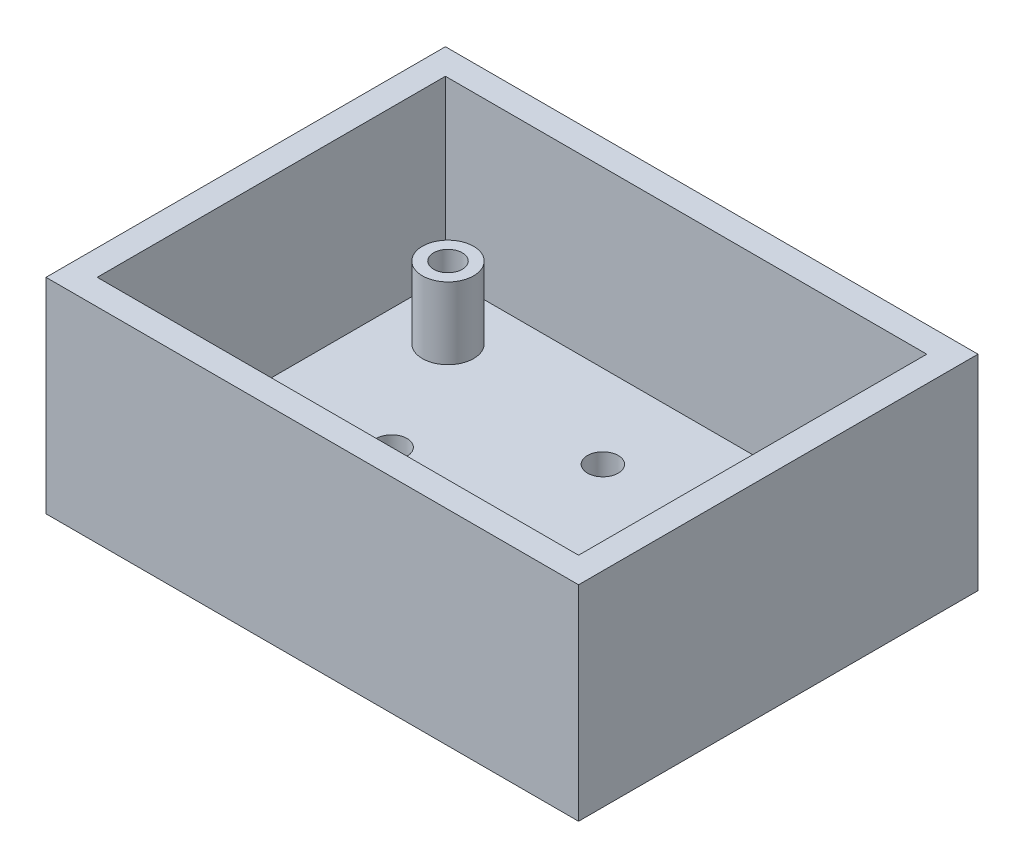
ISO-10303-21;
HEADER;
FILE_DESCRIPTION(('STEP AP214'),'2;1');
FILE_NAME('part.step','',(''),(''),'','','');
FILE_SCHEMA(('AUTOMOTIVE_DESIGN { 1 0 10303 214 1 1 1 1 }'));
ENDSEC;
DATA;
#1=APPLICATION_CONTEXT('core data for automotive mechanical design processes');
#2=APPLICATION_PROTOCOL_DEFINITION('international standard','automotive_design',2000,#1);
#3=PRODUCT_CONTEXT('',#1,'mechanical');
#4=PRODUCT('Part','Part','',(#3));
#5=PRODUCT_RELATED_PRODUCT_CATEGORY('part','',(#4));
#6=PRODUCT_DEFINITION_FORMATION('','',#4);
#7=PRODUCT_DEFINITION_CONTEXT('part definition',#1,'design');
#8=PRODUCT_DEFINITION('design','',#6,#7);
#9=PRODUCT_DEFINITION_SHAPE('','',#8);
#10=(LENGTH_UNIT() NAMED_UNIT(*) SI_UNIT(.MILLI.,.METRE.));
#11=(NAMED_UNIT(*) PLANE_ANGLE_UNIT() SI_UNIT($,.RADIAN.));
#12=(NAMED_UNIT(*) SI_UNIT($,.STERADIAN.) SOLID_ANGLE_UNIT());
#13=UNCERTAINTY_MEASURE_WITH_UNIT(LENGTH_MEASURE(1.E-05),#10,'distance_accuracy_value','');
#14=(GEOMETRIC_REPRESENTATION_CONTEXT(3) GLOBAL_UNCERTAINTY_ASSIGNED_CONTEXT((#13)) GLOBAL_UNIT_ASSIGNED_CONTEXT((#10,
#11,#12)) REPRESENTATION_CONTEXT('',''));
#15=CARTESIAN_POINT('',(0.,0.,0.));
#16=DIRECTION('',(0.,0.,1.));
#17=DIRECTION('',(1.,0.,0.));
#18=AXIS2_PLACEMENT_3D('',#15,#16,#17);
#19=CARTESIAN_POINT('',(23.5,20.,-17.));
#20=DIRECTION('',(-1.,0.,0.));
#21=DIRECTION('',(0.,0.,1.));
#22=AXIS2_PLACEMENT_3D('',#19,#20,#21);
#23=PLANE('',#22);
#24=DIRECTION('',(0.,-1.,0.));
#25=VECTOR('',#24,1.);
#26=CARTESIAN_POINT('',(23.5,20.,-17.));
#27=LINE('',#26,#25);
#28=CARTESIAN_POINT('',(23.5,20.,-17.));
#29=VERTEX_POINT('',#28);
#30=CARTESIAN_POINT('',(23.5,3.,-17.));
#31=VERTEX_POINT('',#30);
#32=EDGE_CURVE('E113',#29,#31,#27,.T.);
#33=ORIENTED_EDGE('',*,*,#32,.T.);
#34=DIRECTION('',(0.,0.,1.));
#35=VECTOR('',#34,1.);
#36=CARTESIAN_POINT('',(23.5,3.,-17.));
#37=LINE('',#36,#35);
#38=CARTESIAN_POINT('',(23.5,3.,17.));
#39=VERTEX_POINT('',#38);
#40=EDGE_CURVE('E101',#31,#39,#37,.T.);
#41=ORIENTED_EDGE('',*,*,#40,.T.);
#42=DIRECTION('',(0.,-1.,0.));
#43=VECTOR('',#42,1.);
#44=CARTESIAN_POINT('',(23.5,20.,17.));
#45=LINE('',#44,#43);
#46=CARTESIAN_POINT('',(23.5,20.,17.));
#47=VERTEX_POINT('',#46);
#48=EDGE_CURVE('E110',#47,#39,#45,.T.);
#49=ORIENTED_EDGE('',*,*,#48,.F.);
#50=DIRECTION('',(0.,0.,-1.));
#51=VECTOR('',#50,1.);
#52=CARTESIAN_POINT('',(23.5,20.,-17.));
#53=LINE('',#52,#51);
#54=EDGE_CURVE('E114',#47,#29,#53,.T.);
#55=ORIENTED_EDGE('',*,*,#54,.T.);
#56=EDGE_LOOP('',(#33,#41,#49,#55));
#57=FACE_BOUND('',#56,.T.);
#58=ADVANCED_FACE('F35',(#57),#23,.T.);
#59=CARTESIAN_POINT('',(-23.5,20.,-17.));
#60=DIRECTION('',(0.,0.,1.));
#61=DIRECTION('',(1.,0.,0.));
#62=AXIS2_PLACEMENT_3D('',#59,#60,#61);
#63=PLANE('',#62);
#64=DIRECTION('',(0.,-1.,0.));
#65=VECTOR('',#64,1.);
#66=CARTESIAN_POINT('',(-23.5,20.,-17.));
#67=LINE('',#66,#65);
#68=CARTESIAN_POINT('',(-23.5,20.,-17.));
#69=VERTEX_POINT('',#68);
#70=CARTESIAN_POINT('',(-23.5,3.,-17.));
#71=VERTEX_POINT('',#70);
#72=EDGE_CURVE('E121',#69,#71,#67,.T.);
#73=ORIENTED_EDGE('',*,*,#72,.T.);
#74=DIRECTION('',(1.,0.,0.));
#75=VECTOR('',#74,1.);
#76=CARTESIAN_POINT('',(-23.5,3.,-17.));
#77=LINE('',#76,#75);
#78=EDGE_CURVE('E115',#71,#31,#77,.T.);
#79=ORIENTED_EDGE('',*,*,#78,.T.);
#80=ORIENTED_EDGE('',*,*,#32,.F.);
#81=DIRECTION('',(-1.,0.,0.));
#82=VECTOR('',#81,1.);
#83=CARTESIAN_POINT('',(-23.5,20.,-17.));
#84=LINE('',#83,#82);
#85=EDGE_CURVE('E200',#29,#69,#84,.T.);
#86=ORIENTED_EDGE('',*,*,#85,.T.);
#87=EDGE_LOOP('',(#73,#79,#80,#86));
#88=FACE_BOUND('',#87,.T.);
#89=ADVANCED_FACE('F209',(#88),#63,.T.);
#90=CARTESIAN_POINT('',(-23.5,20.,-17.));
#91=DIRECTION('',(1.,0.,0.));
#92=DIRECTION('',(0.,0.,-1.));
#93=AXIS2_PLACEMENT_3D('',#90,#91,#92);
#94=PLANE('',#93);
#95=DIRECTION('',(0.,-1.,0.));
#96=VECTOR('',#95,1.);
#97=CARTESIAN_POINT('',(-23.5,20.,17.));
#98=LINE('',#97,#96);
#99=CARTESIAN_POINT('',(-23.5,20.,17.));
#100=VERTEX_POINT('',#99);
#101=CARTESIAN_POINT('',(-23.5,3.,17.));
#102=VERTEX_POINT('',#101);
#103=EDGE_CURVE('E58',#100,#102,#98,.T.);
#104=ORIENTED_EDGE('',*,*,#103,.T.);
#105=DIRECTION('',(0.,0.,-1.));
#106=VECTOR('',#105,1.);
#107=CARTESIAN_POINT('',(-23.5,3.,-17.));
#108=LINE('',#107,#106);
#109=EDGE_CURVE('E51',#102,#71,#108,.T.);
#110=ORIENTED_EDGE('',*,*,#109,.T.);
#111=ORIENTED_EDGE('',*,*,#72,.F.);
#112=DIRECTION('',(0.,0.,1.));
#113=VECTOR('',#112,1.);
#114=CARTESIAN_POINT('',(-23.5,20.,-17.));
#115=LINE('',#114,#113);
#116=EDGE_CURVE('E123',#69,#100,#115,.T.);
#117=ORIENTED_EDGE('',*,*,#116,.T.);
#118=EDGE_LOOP('',(#104,#110,#111,#117));
#119=FACE_BOUND('',#118,.T.);
#120=ADVANCED_FACE('F204',(#119),#94,.T.);
#121=CARTESIAN_POINT('',(-23.5,20.,17.));
#122=DIRECTION('',(0.,0.,-1.));
#123=DIRECTION('',(-1.,0.,0.));
#124=AXIS2_PLACEMENT_3D('',#121,#122,#123);
#125=PLANE('',#124);
#126=ORIENTED_EDGE('',*,*,#48,.T.);
#127=DIRECTION('',(-1.,0.,0.));
#128=VECTOR('',#127,1.);
#129=CARTESIAN_POINT('',(-23.5,3.,17.));
#130=LINE('',#129,#128);
#131=EDGE_CURVE('E98',#39,#102,#130,.T.);
#132=ORIENTED_EDGE('',*,*,#131,.T.);
#133=ORIENTED_EDGE('',*,*,#103,.F.);
#134=DIRECTION('',(1.,0.,0.));
#135=VECTOR('',#134,1.);
#136=CARTESIAN_POINT('',(-23.5,20.,17.));
#137=LINE('',#136,#135);
#138=EDGE_CURVE('E119',#100,#47,#137,.T.);
#139=ORIENTED_EDGE('',*,*,#138,.T.);
#140=EDGE_LOOP('',(#126,#132,#133,#139));
#141=FACE_BOUND('',#140,.T.);
#142=ADVANCED_FACE('F117',(#141),#125,.T.);
#143=CARTESIAN_POINT('',(0.,20.,0.));
#144=DIRECTION('',(0.,1.,0.));
#145=DIRECTION('',(0.,0.,1.));
#146=AXIS2_PLACEMENT_3D('',#143,#144,#145);
#147=PLANE('',#146);
#148=DIRECTION('',(0.,0.,-1.));
#149=VECTOR('',#148,1.);
#150=CARTESIAN_POINT('',(26.,20.,-19.5));
#151=LINE('',#150,#149);
#152=CARTESIAN_POINT('',(26.,20.,19.5));
#153=VERTEX_POINT('',#152);
#154=CARTESIAN_POINT('',(26.,20.,-19.5));
#155=VERTEX_POINT('',#154);
#156=EDGE_CURVE('E131',#153,#155,#151,.T.);
#157=ORIENTED_EDGE('',*,*,#156,.T.);
#158=DIRECTION('',(-1.,0.,0.));
#159=VECTOR('',#158,1.);
#160=CARTESIAN_POINT('',(-26.,20.,-19.5));
#161=LINE('',#160,#159);
#162=CARTESIAN_POINT('',(-26.,20.,-19.5));
#163=VERTEX_POINT('',#162);
#164=EDGE_CURVE('E134',#155,#163,#161,.T.);
#165=ORIENTED_EDGE('',*,*,#164,.T.);
#166=DIRECTION('',(0.,0.,1.));
#167=VECTOR('',#166,1.);
#168=CARTESIAN_POINT('',(-26.,20.,-19.5));
#169=LINE('',#168,#167);
#170=CARTESIAN_POINT('',(-26.,20.,19.5));
#171=VERTEX_POINT('',#170);
#172=EDGE_CURVE('E137',#163,#171,#169,.T.);
#173=ORIENTED_EDGE('',*,*,#172,.T.);
#174=DIRECTION('',(1.,0.,0.));
#175=VECTOR('',#174,1.);
#176=CARTESIAN_POINT('',(-26.,20.,19.5));
#177=LINE('',#176,#175);
#178=EDGE_CURVE('E139',#171,#153,#177,.T.);
#179=ORIENTED_EDGE('',*,*,#178,.T.);
#180=EDGE_LOOP('',(#157,#165,#173,#179));
#181=FACE_BOUND('',#180,.T.);
#182=ORIENTED_EDGE('',*,*,#85,.F.);
#183=ORIENTED_EDGE('',*,*,#54,.F.);
#184=ORIENTED_EDGE('',*,*,#138,.F.);
#185=ORIENTED_EDGE('',*,*,#116,.F.);
#186=EDGE_LOOP('',(#182,#183,#184,#185));
#187=FACE_BOUND('',#186,.T.);
#188=ADVANCED_FACE('F207',(#181,#187),#147,.T.);
#189=CARTESIAN_POINT('',(0.,0.,0.));
#190=DIRECTION('',(0.,1.,0.));
#191=DIRECTION('',(0.,0.,1.));
#192=AXIS2_PLACEMENT_3D('',#189,#190,#191);
#193=PLANE('',#192);
#194=CARTESIAN_POINT('',(11.75,0.,0.));
#195=DIRECTION('',(0.,1.,0.));
#196=DIRECTION('',(0.,0.,1.));
#197=AXIS2_PLACEMENT_3D('',#194,#195,#196);
#198=CIRCLE('',#197,1.5);
#199=CARTESIAN_POINT('',(11.75,0.,1.5));
#200=VERTEX_POINT('',#199);
#201=EDGE_CURVE('E518',#200,#200,#198,.T.);
#202=ORIENTED_EDGE('',*,*,#201,.T.);
#203=EDGE_LOOP('',(#202));
#204=FACE_BOUND('',#203,.T.);
#205=CARTESIAN_POINT('',(0.,0.,8.87235349110716));
#206=DIRECTION('',(0.,1.,0.));
#207=DIRECTION('',(0.,0.,-1.));
#208=AXIS2_PLACEMENT_3D('',#205,#206,#207);
#209=CIRCLE('',#208,1.5);
#210=CARTESIAN_POINT('',(0.,0.,7.37235349110716));
#211=VERTEX_POINT('',#210);
#212=EDGE_CURVE('E522',#211,#211,#209,.T.);
#213=ORIENTED_EDGE('',*,*,#212,.T.);
#214=EDGE_LOOP('',(#213));
#215=FACE_BOUND('',#214,.T.);
#216=CARTESIAN_POINT('',(-11.75,0.,0.));
#217=DIRECTION('',(0.,1.,0.));
#218=DIRECTION('',(0.,0.,-1.));
#219=AXIS2_PLACEMENT_3D('',#216,#217,#218);
#220=CIRCLE('',#219,1.5);
#221=CARTESIAN_POINT('',(-11.75,0.,-1.5));
#222=VERTEX_POINT('',#221);
#223=EDGE_CURVE('E532',#222,#222,#220,.T.);
#224=ORIENTED_EDGE('',*,*,#223,.T.);
#225=EDGE_LOOP('',(#224));
#226=FACE_BOUND('',#225,.T.);
#227=CARTESIAN_POINT('',(0.,0.,-8.87235349110716));
#228=DIRECTION('',(0.,1.,0.));
#229=DIRECTION('',(0.,0.,1.));
#230=AXIS2_PLACEMENT_3D('',#227,#228,#229);
#231=CIRCLE('',#230,1.5);
#232=CARTESIAN_POINT('',(0.,0.,-7.37235349110716));
#233=VERTEX_POINT('',#232);
#234=EDGE_CURVE('E538',#233,#233,#231,.T.);
#235=ORIENTED_EDGE('',*,*,#234,.T.);
#236=EDGE_LOOP('',(#235));
#237=FACE_BOUND('',#236,.T.);
#238=DIRECTION('',(0.,0.,-1.));
#239=VECTOR('',#238,1.);
#240=CARTESIAN_POINT('',(26.,0.,-19.5));
#241=LINE('',#240,#239);
#242=CARTESIAN_POINT('',(26.,0.,19.5));
#243=VERTEX_POINT('',#242);
#244=CARTESIAN_POINT('',(26.,0.,-19.5));
#245=VERTEX_POINT('',#244);
#246=EDGE_CURVE('E130',#243,#245,#241,.T.);
#247=ORIENTED_EDGE('',*,*,#246,.F.);
#248=DIRECTION('',(1.,0.,0.));
#249=VECTOR('',#248,1.);
#250=CARTESIAN_POINT('',(-26.,0.,19.5));
#251=LINE('',#250,#249);
#252=CARTESIAN_POINT('',(-26.,0.,19.5));
#253=VERTEX_POINT('',#252);
#254=EDGE_CURVE('E135',#253,#243,#251,.T.);
#255=ORIENTED_EDGE('',*,*,#254,.F.);
#256=DIRECTION('',(0.,0.,1.));
#257=VECTOR('',#256,1.);
#258=CARTESIAN_POINT('',(-26.,0.,-19.5));
#259=LINE('',#258,#257);
#260=CARTESIAN_POINT('',(-26.,0.,-19.5));
#261=VERTEX_POINT('',#260);
#262=EDGE_CURVE('E147',#261,#253,#259,.T.);
#263=ORIENTED_EDGE('',*,*,#262,.F.);
#264=DIRECTION('',(-1.,0.,0.));
#265=VECTOR('',#264,1.);
#266=CARTESIAN_POINT('',(-26.,0.,-19.5));
#267=LINE('',#266,#265);
#268=EDGE_CURVE('E144',#245,#261,#267,.T.);
#269=ORIENTED_EDGE('',*,*,#268,.F.);
#270=EDGE_LOOP('',(#247,#255,#263,#269));
#271=FACE_BOUND('',#270,.T.);
#272=ADVANCED_FACE('F222',(#204,#215,#226,#237,#271),#193,.F.);
#273=CARTESIAN_POINT('',(26.,20.,-19.5));
#274=DIRECTION('',(-1.,0.,0.));
#275=DIRECTION('',(0.,0.,1.));
#276=AXIS2_PLACEMENT_3D('',#273,#274,#275);
#277=PLANE('',#276);
#278=ORIENTED_EDGE('',*,*,#246,.T.);
#279=DIRECTION('',(0.,-1.,0.));
#280=VECTOR('',#279,1.);
#281=CARTESIAN_POINT('',(26.,20.,-19.5));
#282=LINE('',#281,#280);
#283=EDGE_CURVE('E105',#155,#245,#282,.T.);
#284=ORIENTED_EDGE('',*,*,#283,.F.);
#285=ORIENTED_EDGE('',*,*,#156,.F.);
#286=DIRECTION('',(0.,-1.,0.));
#287=VECTOR('',#286,1.);
#288=CARTESIAN_POINT('',(26.,20.,19.5));
#289=LINE('',#288,#287);
#290=EDGE_CURVE('E141',#153,#243,#289,.T.);
#291=ORIENTED_EDGE('',*,*,#290,.T.);
#292=EDGE_LOOP('',(#278,#284,#285,#291));
#293=FACE_BOUND('',#292,.T.);
#294=ADVANCED_FACE('F37',(#293),#277,.F.);
#295=CARTESIAN_POINT('',(-26.,20.,-19.5));
#296=DIRECTION('',(0.,0.,1.));
#297=DIRECTION('',(1.,0.,0.));
#298=AXIS2_PLACEMENT_3D('',#295,#296,#297);
#299=PLANE('',#298);
#300=ORIENTED_EDGE('',*,*,#268,.T.);
#301=DIRECTION('',(0.,-1.,0.));
#302=VECTOR('',#301,1.);
#303=CARTESIAN_POINT('',(-26.,20.,-19.5));
#304=LINE('',#303,#302);
#305=EDGE_CURVE('E155',#163,#261,#304,.T.);
#306=ORIENTED_EDGE('',*,*,#305,.F.);
#307=ORIENTED_EDGE('',*,*,#164,.F.);
#308=ORIENTED_EDGE('',*,*,#283,.T.);
#309=EDGE_LOOP('',(#300,#306,#307,#308));
#310=FACE_BOUND('',#309,.T.);
#311=ADVANCED_FACE('F233',(#310),#299,.F.);
#312=CARTESIAN_POINT('',(-26.,20.,-19.5));
#313=DIRECTION('',(1.,0.,0.));
#314=DIRECTION('',(0.,0.,-1.));
#315=AXIS2_PLACEMENT_3D('',#312,#313,#314);
#316=PLANE('',#315);
#317=ORIENTED_EDGE('',*,*,#262,.T.);
#318=DIRECTION('',(0.,-1.,0.));
#319=VECTOR('',#318,1.);
#320=CARTESIAN_POINT('',(-26.,20.,19.5));
#321=LINE('',#320,#319);
#322=EDGE_CURVE('E153',#171,#253,#321,.T.);
#323=ORIENTED_EDGE('',*,*,#322,.F.);
#324=ORIENTED_EDGE('',*,*,#172,.F.);
#325=ORIENTED_EDGE('',*,*,#305,.T.);
#326=EDGE_LOOP('',(#317,#323,#324,#325));
#327=FACE_BOUND('',#326,.T.);
#328=ADVANCED_FACE('F230',(#327),#316,.F.);
#329=CARTESIAN_POINT('',(-26.,20.,19.5));
#330=DIRECTION('',(0.,0.,-1.));
#331=DIRECTION('',(-1.,0.,0.));
#332=AXIS2_PLACEMENT_3D('',#329,#330,#331);
#333=PLANE('',#332);
#334=ORIENTED_EDGE('',*,*,#254,.T.);
#335=ORIENTED_EDGE('',*,*,#290,.F.);
#336=ORIENTED_EDGE('',*,*,#178,.F.);
#337=ORIENTED_EDGE('',*,*,#322,.T.);
#338=EDGE_LOOP('',(#334,#335,#336,#337));
#339=FACE_BOUND('',#338,.T.);
#340=ADVANCED_FACE('F227',(#339),#333,.F.);
#341=CARTESIAN_POINT('',(0.,3.,0.));
#342=DIRECTION('',(0.,-1.,0.));
#343=DIRECTION('',(0.,0.,-1.));
#344=AXIS2_PLACEMENT_3D('',#341,#342,#343);
#345=PLANE('',#344);
#346=CARTESIAN_POINT('',(11.75,3.,0.));
#347=DIRECTION('',(0.,1.,0.));
#348=DIRECTION('',(0.,0.,1.));
#349=AXIS2_PLACEMENT_3D('',#346,#347,#348);
#350=CIRCLE('',#349,1.5);
#351=CARTESIAN_POINT('',(11.75,3.,1.5));
#352=VERTEX_POINT('',#351);
#353=EDGE_CURVE('E521',#352,#352,#350,.T.);
#354=ORIENTED_EDGE('',*,*,#353,.F.);
#355=EDGE_LOOP('',(#354));
#356=FACE_BOUND('',#355,.T.);
#357=CARTESIAN_POINT('',(0.,3.,8.87235349110716));
#358=DIRECTION('',(0.,1.,0.));
#359=DIRECTION('',(0.,0.,-1.));
#360=AXIS2_PLACEMENT_3D('',#357,#358,#359);
#361=CIRCLE('',#360,1.5);
#362=CARTESIAN_POINT('',(0.,3.,7.37235349110716));
#363=VERTEX_POINT('',#362);
#364=EDGE_CURVE('E527',#363,#363,#361,.T.);
#365=ORIENTED_EDGE('',*,*,#364,.F.);
#366=EDGE_LOOP('',(#365));
#367=FACE_BOUND('',#366,.T.);
#368=CARTESIAN_POINT('',(-11.75,3.,0.));
#369=DIRECTION('',(0.,1.,0.));
#370=DIRECTION('',(0.,0.,-1.));
#371=AXIS2_PLACEMENT_3D('',#368,#369,#370);
#372=CIRCLE('',#371,1.5);
#373=CARTESIAN_POINT('',(-11.75,3.,-1.5));
#374=VERTEX_POINT('',#373);
#375=EDGE_CURVE('E535',#374,#374,#372,.T.);
#376=ORIENTED_EDGE('',*,*,#375,.F.);
#377=EDGE_LOOP('',(#376));
#378=FACE_BOUND('',#377,.T.);
#379=CARTESIAN_POINT('',(0.,3.,-8.87235349110716));
#380=DIRECTION('',(0.,1.,0.));
#381=DIRECTION('',(0.,0.,1.));
#382=AXIS2_PLACEMENT_3D('',#379,#380,#381);
#383=CIRCLE('',#382,1.5);
#384=CARTESIAN_POINT('',(0.,3.,-7.37235349110716));
#385=VERTEX_POINT('',#384);
#386=EDGE_CURVE('E524',#385,#385,#383,.T.);
#387=ORIENTED_EDGE('',*,*,#386,.F.);
#388=EDGE_LOOP('',(#387));
#389=FACE_BOUND('',#388,.T.);
#390=CARTESIAN_POINT('',(17.75,3.,-11.5));
#391=DIRECTION('',(0.,-1.,0.));
#392=DIRECTION('',(0.,0.,-1.));
#393=AXIS2_PLACEMENT_3D('',#390,#391,#392);
#394=CIRCLE('',#393,2.5);
#395=CARTESIAN_POINT('',(17.75,3.,-14.));
#396=VERTEX_POINT('',#395);
#397=EDGE_CURVE('E39',#396,#396,#394,.T.);
#398=ORIENTED_EDGE('',*,*,#397,.T.);
#399=EDGE_LOOP('',(#398));
#400=FACE_BOUND('',#399,.T.);
#401=CARTESIAN_POINT('',(-17.75,3.,-11.5));
#402=DIRECTION('',(0.,-1.,0.));
#403=DIRECTION('',(0.,0.,-1.));
#404=AXIS2_PLACEMENT_3D('',#401,#402,#403);
#405=CIRCLE('',#404,2.5);
#406=CARTESIAN_POINT('',(-17.75,3.,-14.));
#407=VERTEX_POINT('',#406);
#408=EDGE_CURVE('E174',#407,#407,#405,.T.);
#409=ORIENTED_EDGE('',*,*,#408,.T.);
#410=EDGE_LOOP('',(#409));
#411=FACE_BOUND('',#410,.T.);
#412=CARTESIAN_POINT('',(17.75,3.,11.5));
#413=DIRECTION('',(0.,-1.,0.));
#414=DIRECTION('',(0.,0.,-1.));
#415=AXIS2_PLACEMENT_3D('',#412,#413,#414);
#416=CIRCLE('',#415,2.5);
#417=CARTESIAN_POINT('',(17.75,3.,9.00000000000001));
#418=VERTEX_POINT('',#417);
#419=EDGE_CURVE('E167',#418,#418,#416,.T.);
#420=ORIENTED_EDGE('',*,*,#419,.T.);
#421=EDGE_LOOP('',(#420));
#422=FACE_BOUND('',#421,.T.);
#423=CARTESIAN_POINT('',(-17.75,3.,11.5));
#424=DIRECTION('',(0.,-1.,0.));
#425=DIRECTION('',(0.,0.,-1.));
#426=AXIS2_PLACEMENT_3D('',#423,#424,#425);
#427=CIRCLE('',#426,2.5);
#428=CARTESIAN_POINT('',(-17.75,3.,9.));
#429=VERTEX_POINT('',#428);
#430=EDGE_CURVE('E161',#429,#429,#427,.T.);
#431=ORIENTED_EDGE('',*,*,#430,.T.);
#432=EDGE_LOOP('',(#431));
#433=FACE_BOUND('',#432,.T.);
#434=ORIENTED_EDGE('',*,*,#40,.F.);
#435=ORIENTED_EDGE('',*,*,#78,.F.);
#436=ORIENTED_EDGE('',*,*,#109,.F.);
#437=ORIENTED_EDGE('',*,*,#131,.F.);
#438=EDGE_LOOP('',(#434,#435,#436,#437));
#439=FACE_BOUND('',#438,.T.);
#440=ADVANCED_FACE('F100',(#356,#367,#378,#389,#400,#411,#422,#433,#439),#345,.F.);
#441=CARTESIAN_POINT('',(-17.75,10.,11.5));
#442=DIRECTION('',(0.,-1.,0.));
#443=DIRECTION('',(0.,0.,-1.));
#444=AXIS2_PLACEMENT_3D('',#441,#442,#443);
#445=CYLINDRICAL_SURFACE('',#444,2.5);
#446=CARTESIAN_POINT('',(-17.75,10.,11.5));
#447=DIRECTION('',(0.,-1.,0.));
#448=DIRECTION('',(0.,0.,-1.));
#449=AXIS2_PLACEMENT_3D('',#446,#447,#448);
#450=CIRCLE('',#449,2.5);
#451=CARTESIAN_POINT('',(-17.75,10.,9.));
#452=VERTEX_POINT('',#451);
#453=EDGE_CURVE('E164',#452,#452,#450,.T.);
#454=ORIENTED_EDGE('',*,*,#453,.T.);
#455=EDGE_LOOP('',(#454));
#456=FACE_BOUND('',#455,.T.);
#457=ORIENTED_EDGE('',*,*,#430,.F.);
#458=EDGE_LOOP('',(#457));
#459=FACE_BOUND('',#458,.T.);
#460=ADVANCED_FACE('F289',(#456,#459),#445,.T.);
#461=CARTESIAN_POINT('',(-17.75,10.,11.5));
#462=DIRECTION('',(0.,-1.,0.));
#463=DIRECTION('',(0.,0.,-1.));
#464=AXIS2_PLACEMENT_3D('',#461,#462,#463);
#465=PLANE('',#464);
#466=CARTESIAN_POINT('',(-17.75,10.,11.5));
#467=DIRECTION('',(0.,1.,0.));
#468=DIRECTION('',(0.,0.,1.));
#469=AXIS2_PLACEMENT_3D('',#466,#467,#468);
#470=CIRCLE('',#469,1.4);
#471=CARTESIAN_POINT('',(-17.75,10.,12.9));
#472=VERTEX_POINT('',#471);
#473=EDGE_CURVE('E170',#472,#472,#470,.T.);
#474=ORIENTED_EDGE('',*,*,#473,.F.);
#475=EDGE_LOOP('',(#474));
#476=FACE_BOUND('',#475,.T.);
#477=ORIENTED_EDGE('',*,*,#453,.F.);
#478=EDGE_LOOP('',(#477));
#479=FACE_BOUND('',#478,.T.);
#480=ADVANCED_FACE('F295',(#476,#479),#465,.F.);
#481=CARTESIAN_POINT('',(-17.75,3.,11.5));
#482=DIRECTION('',(0.,1.,0.));
#483=DIRECTION('',(0.,0.,1.));
#484=AXIS2_PLACEMENT_3D('',#481,#482,#483);
#485=CYLINDRICAL_SURFACE('',#484,1.4);
#486=CARTESIAN_POINT('',(-17.75,3.,11.5));
#487=DIRECTION('',(0.,-1.,0.));
#488=DIRECTION('',(0.,0.,-1.));
#489=AXIS2_PLACEMENT_3D('',#486,#487,#488);
#490=CIRCLE('',#489,1.4);
#491=CARTESIAN_POINT('',(-17.75,3.,10.1));
#492=VERTEX_POINT('',#491);
#493=EDGE_CURVE('E104',#492,#492,#490,.T.);
#494=ORIENTED_EDGE('',*,*,#493,.T.);
#495=EDGE_LOOP('',(#494));
#496=FACE_BOUND('',#495,.T.);
#497=ORIENTED_EDGE('',*,*,#473,.T.);
#498=EDGE_LOOP('',(#497));
#499=FACE_BOUND('',#498,.T.);
#500=ADVANCED_FACE('F305',(#496,#499),#485,.F.);
#501=ORIENTED_EDGE('',*,*,#493,.F.);
#502=EDGE_LOOP('',(#501));
#503=FACE_BOUND('',#502,.T.);
#504=ADVANCED_FACE('F314',(#503),#345,.F.);
#505=CARTESIAN_POINT('',(17.75,10.,11.5));
#506=DIRECTION('',(0.,-1.,0.));
#507=DIRECTION('',(0.,0.,-1.));
#508=AXIS2_PLACEMENT_3D('',#505,#506,#507);
#509=CYLINDRICAL_SURFACE('',#508,2.5);
#510=CARTESIAN_POINT('',(17.75,10.,11.5));
#511=DIRECTION('',(0.,-1.,0.));
#512=DIRECTION('',(0.,0.,-1.));
#513=AXIS2_PLACEMENT_3D('',#510,#511,#512);
#514=CIRCLE('',#513,2.5);
#515=CARTESIAN_POINT('',(17.75,10.,9.00000000000001));
#516=VERTEX_POINT('',#515);
#517=EDGE_CURVE('E171',#516,#516,#514,.T.);
#518=ORIENTED_EDGE('',*,*,#517,.T.);
#519=EDGE_LOOP('',(#518));
#520=FACE_BOUND('',#519,.T.);
#521=ORIENTED_EDGE('',*,*,#419,.F.);
#522=EDGE_LOOP('',(#521));
#523=FACE_BOUND('',#522,.T.);
#524=ADVANCED_FACE('F319',(#520,#523),#509,.T.);
#525=CARTESIAN_POINT('',(17.75,10.,11.5));
#526=DIRECTION('',(0.,-1.,0.));
#527=DIRECTION('',(0.,0.,-1.));
#528=AXIS2_PLACEMENT_3D('',#525,#526,#527);
#529=PLANE('',#528);
#530=CARTESIAN_POINT('',(17.75,10.,11.5));
#531=DIRECTION('',(0.,1.,0.));
#532=DIRECTION('',(0.,0.,1.));
#533=AXIS2_PLACEMENT_3D('',#530,#531,#532);
#534=CIRCLE('',#533,1.4);
#535=CARTESIAN_POINT('',(17.75,10.,12.9));
#536=VERTEX_POINT('',#535);
#537=EDGE_CURVE('E176',#536,#536,#534,.T.);
#538=ORIENTED_EDGE('',*,*,#537,.F.);
#539=EDGE_LOOP('',(#538));
#540=FACE_BOUND('',#539,.T.);
#541=ORIENTED_EDGE('',*,*,#517,.F.);
#542=EDGE_LOOP('',(#541));
#543=FACE_BOUND('',#542,.T.);
#544=ADVANCED_FACE('F325',(#540,#543),#529,.F.);
#545=CARTESIAN_POINT('',(17.75,3.,11.5));
#546=DIRECTION('',(0.,1.,0.));
#547=DIRECTION('',(0.,0.,1.));
#548=AXIS2_PLACEMENT_3D('',#545,#546,#547);
#549=CYLINDRICAL_SURFACE('',#548,1.4);
#550=CARTESIAN_POINT('',(17.75,3.,11.5));
#551=DIRECTION('',(0.,-1.,0.));
#552=DIRECTION('',(0.,0.,-1.));
#553=AXIS2_PLACEMENT_3D('',#550,#551,#552);
#554=CIRCLE('',#553,1.4);
#555=CARTESIAN_POINT('',(17.75,3.,10.1));
#556=VERTEX_POINT('',#555);
#557=EDGE_CURVE('E160',#556,#556,#554,.T.);
#558=ORIENTED_EDGE('',*,*,#557,.T.);
#559=EDGE_LOOP('',(#558));
#560=FACE_BOUND('',#559,.T.);
#561=ORIENTED_EDGE('',*,*,#537,.T.);
#562=EDGE_LOOP('',(#561));
#563=FACE_BOUND('',#562,.T.);
#564=ADVANCED_FACE('F334',(#560,#563),#549,.F.);
#565=ORIENTED_EDGE('',*,*,#557,.F.);
#566=EDGE_LOOP('',(#565));
#567=FACE_BOUND('',#566,.T.);
#568=ADVANCED_FACE('F343',(#567),#345,.F.);
#569=CARTESIAN_POINT('',(-17.75,10.,-11.5));
#570=DIRECTION('',(0.,-1.,0.));
#571=DIRECTION('',(0.,0.,-1.));
#572=AXIS2_PLACEMENT_3D('',#569,#570,#571);
#573=CYLINDRICAL_SURFACE('',#572,2.5);
#574=CARTESIAN_POINT('',(-17.75,10.,-11.5));
#575=DIRECTION('',(0.,-1.,0.));
#576=DIRECTION('',(0.,0.,-1.));
#577=AXIS2_PLACEMENT_3D('',#574,#575,#576);
#578=CIRCLE('',#577,2.5);
#579=CARTESIAN_POINT('',(-17.75,10.,-14.));
#580=VERTEX_POINT('',#579);
#581=EDGE_CURVE('E177',#580,#580,#578,.T.);
#582=ORIENTED_EDGE('',*,*,#581,.T.);
#583=EDGE_LOOP('',(#582));
#584=FACE_BOUND('',#583,.T.);
#585=ORIENTED_EDGE('',*,*,#408,.F.);
#586=EDGE_LOOP('',(#585));
#587=FACE_BOUND('',#586,.T.);
#588=ADVANCED_FACE('F348',(#584,#587),#573,.T.);
#589=CARTESIAN_POINT('',(-17.75,10.,-11.5));
#590=DIRECTION('',(0.,-1.,0.));
#591=DIRECTION('',(0.,0.,-1.));
#592=AXIS2_PLACEMENT_3D('',#589,#590,#591);
#593=PLANE('',#592);
#594=CARTESIAN_POINT('',(-17.75,10.,-11.5));
#595=DIRECTION('',(0.,1.,0.));
#596=DIRECTION('',(0.,0.,1.));
#597=AXIS2_PLACEMENT_3D('',#594,#595,#596);
#598=CIRCLE('',#597,1.4);
#599=CARTESIAN_POINT('',(-17.75,10.,-10.1));
#600=VERTEX_POINT('',#599);
#601=EDGE_CURVE('E183',#600,#600,#598,.T.);
#602=ORIENTED_EDGE('',*,*,#601,.F.);
#603=EDGE_LOOP('',(#602));
#604=FACE_BOUND('',#603,.T.);
#605=ORIENTED_EDGE('',*,*,#581,.F.);
#606=EDGE_LOOP('',(#605));
#607=FACE_BOUND('',#606,.T.);
#608=ADVANCED_FACE('F354',(#604,#607),#593,.F.);
#609=CARTESIAN_POINT('',(-17.75,3.,-11.5));
#610=DIRECTION('',(0.,1.,0.));
#611=DIRECTION('',(0.,0.,1.));
#612=AXIS2_PLACEMENT_3D('',#609,#610,#611);
#613=CYLINDRICAL_SURFACE('',#612,1.4);
#614=CARTESIAN_POINT('',(-17.75,3.,-11.5));
#615=DIRECTION('',(0.,-1.,0.));
#616=DIRECTION('',(0.,0.,-1.));
#617=AXIS2_PLACEMENT_3D('',#614,#615,#616);
#618=CIRCLE('',#617,1.4);
#619=CARTESIAN_POINT('',(-17.75,3.,-12.9));
#620=VERTEX_POINT('',#619);
#621=EDGE_CURVE('E44',#620,#620,#618,.T.);
#622=ORIENTED_EDGE('',*,*,#621,.T.);
#623=EDGE_LOOP('',(#622));
#624=FACE_BOUND('',#623,.T.);
#625=ORIENTED_EDGE('',*,*,#601,.T.);
#626=EDGE_LOOP('',(#625));
#627=FACE_BOUND('',#626,.T.);
#628=ADVANCED_FACE('F362',(#624,#627),#613,.F.);
#629=ORIENTED_EDGE('',*,*,#621,.F.);
#630=EDGE_LOOP('',(#629));
#631=FACE_BOUND('',#630,.T.);
#632=ADVANCED_FACE('F371',(#631),#345,.F.);
#633=CARTESIAN_POINT('',(17.75,10.,-11.5));
#634=DIRECTION('',(0.,-1.,0.));
#635=DIRECTION('',(0.,0.,-1.));
#636=AXIS2_PLACEMENT_3D('',#633,#634,#635);
#637=CYLINDRICAL_SURFACE('',#636,2.5);
#638=CARTESIAN_POINT('',(17.75,10.,-11.5));
#639=DIRECTION('',(0.,-1.,0.));
#640=DIRECTION('',(0.,0.,-1.));
#641=AXIS2_PLACEMENT_3D('',#638,#639,#640);
#642=CIRCLE('',#641,2.5);
#643=CARTESIAN_POINT('',(17.75,10.,-14.));
#644=VERTEX_POINT('',#643);
#645=EDGE_CURVE('E545',#644,#644,#642,.T.);
#646=ORIENTED_EDGE('',*,*,#645,.T.);
#647=EDGE_LOOP('',(#646));
#648=FACE_BOUND('',#647,.T.);
#649=ORIENTED_EDGE('',*,*,#397,.F.);
#650=EDGE_LOOP('',(#649));
#651=FACE_BOUND('',#650,.T.);
#652=ADVANCED_FACE('F376',(#648,#651),#637,.T.);
#653=CARTESIAN_POINT('',(17.75,10.,-11.5));
#654=DIRECTION('',(0.,-1.,0.));
#655=DIRECTION('',(0.,0.,-1.));
#656=AXIS2_PLACEMENT_3D('',#653,#654,#655);
#657=PLANE('',#656);
#658=CARTESIAN_POINT('',(17.75,10.,-11.5));
#659=DIRECTION('',(0.,1.,0.));
#660=DIRECTION('',(0.,0.,1.));
#661=AXIS2_PLACEMENT_3D('',#658,#659,#660);
#662=CIRCLE('',#661,1.4);
#663=CARTESIAN_POINT('',(17.75,10.,-10.1));
#664=VERTEX_POINT('',#663);
#665=EDGE_CURVE('E541',#664,#664,#662,.T.);
#666=ORIENTED_EDGE('',*,*,#665,.F.);
#667=EDGE_LOOP('',(#666));
#668=FACE_BOUND('',#667,.T.);
#669=ORIENTED_EDGE('',*,*,#645,.F.);
#670=EDGE_LOOP('',(#669));
#671=FACE_BOUND('',#670,.T.);
#672=ADVANCED_FACE('F382',(#668,#671),#657,.F.);
#673=CARTESIAN_POINT('',(17.75,3.,-11.5));
#674=DIRECTION('',(0.,1.,0.));
#675=DIRECTION('',(0.,0.,1.));
#676=AXIS2_PLACEMENT_3D('',#673,#674,#675);
#677=CYLINDRICAL_SURFACE('',#676,1.4);
#678=CARTESIAN_POINT('',(17.75,3.,-11.5));
#679=DIRECTION('',(0.,-1.,0.));
#680=DIRECTION('',(0.,0.,-1.));
#681=AXIS2_PLACEMENT_3D('',#678,#679,#680);
#682=CIRCLE('',#681,1.4);
#683=CARTESIAN_POINT('',(17.75,3.,-12.9));
#684=VERTEX_POINT('',#683);
#685=EDGE_CURVE('E11',#684,#684,#682,.T.);
#686=ORIENTED_EDGE('',*,*,#685,.T.);
#687=EDGE_LOOP('',(#686));
#688=FACE_BOUND('',#687,.T.);
#689=ORIENTED_EDGE('',*,*,#665,.T.);
#690=EDGE_LOOP('',(#689));
#691=FACE_BOUND('',#690,.T.);
#692=ADVANCED_FACE('F391',(#688,#691),#677,.F.);
#693=ORIENTED_EDGE('',*,*,#685,.F.);
#694=EDGE_LOOP('',(#693));
#695=FACE_BOUND('',#694,.T.);
#696=ADVANCED_FACE('F399',(#695),#345,.F.);
#697=CARTESIAN_POINT('',(0.,0.,-8.87235349110716));
#698=DIRECTION('',(0.,1.,0.));
#699=DIRECTION('',(0.,0.,1.));
#700=AXIS2_PLACEMENT_3D('',#697,#698,#699);
#701=CYLINDRICAL_SURFACE('',#700,1.5);
#702=ORIENTED_EDGE('',*,*,#234,.F.);
#703=EDGE_LOOP('',(#702));
#704=FACE_BOUND('',#703,.T.);
#705=ORIENTED_EDGE('',*,*,#386,.T.);
#706=EDGE_LOOP('',(#705));
#707=FACE_BOUND('',#706,.T.);
#708=ADVANCED_FACE('F439',(#704,#707),#701,.F.);
#709=CARTESIAN_POINT('',(-11.75,0.,0.));
#710=DIRECTION('',(0.,1.,0.));
#711=DIRECTION('',(0.,0.,1.));
#712=AXIS2_PLACEMENT_3D('',#709,#710,#711);
#713=CYLINDRICAL_SURFACE('',#712,1.5);
#714=ORIENTED_EDGE('',*,*,#223,.F.);
#715=EDGE_LOOP('',(#714));
#716=FACE_BOUND('',#715,.T.);
#717=ORIENTED_EDGE('',*,*,#375,.T.);
#718=EDGE_LOOP('',(#717));
#719=FACE_BOUND('',#718,.T.);
#720=ADVANCED_FACE('F446',(#716,#719),#713,.F.);
#721=CARTESIAN_POINT('',(0.,0.,8.87235349110716));
#722=DIRECTION('',(0.,1.,0.));
#723=DIRECTION('',(0.,0.,1.));
#724=AXIS2_PLACEMENT_3D('',#721,#722,#723);
#725=CYLINDRICAL_SURFACE('',#724,1.5);
#726=ORIENTED_EDGE('',*,*,#212,.F.);
#727=EDGE_LOOP('',(#726));
#728=FACE_BOUND('',#727,.T.);
#729=ORIENTED_EDGE('',*,*,#364,.T.);
#730=EDGE_LOOP('',(#729));
#731=FACE_BOUND('',#730,.T.);
#732=ADVANCED_FACE('F455',(#728,#731),#725,.F.);
#733=CARTESIAN_POINT('',(11.75,0.,0.));
#734=DIRECTION('',(0.,1.,0.));
#735=DIRECTION('',(0.,0.,1.));
#736=AXIS2_PLACEMENT_3D('',#733,#734,#735);
#737=CYLINDRICAL_SURFACE('',#736,1.5);
#738=ORIENTED_EDGE('',*,*,#201,.F.);
#739=EDGE_LOOP('',(#738));
#740=FACE_BOUND('',#739,.T.);
#741=ORIENTED_EDGE('',*,*,#353,.T.);
#742=EDGE_LOOP('',(#741));
#743=FACE_BOUND('',#742,.T.);
#744=ADVANCED_FACE('F464',(#740,#743),#737,.F.);
#745=CLOSED_SHELL('',(#58,#89,#120,#142,#188,#272,#294,#311,#328,#340,#440,#460,#480,#500,#504,
#524,#544,#564,#568,#588,#608,#628,#632,#652,#672,#692,#696,#708,#720,#732,#744));
#746=MANIFOLD_SOLID_BREP('B2',#745);
#747=ADVANCED_BREP_SHAPE_REPRESENTATION('',(#18,#746),#14);
#748=SHAPE_DEFINITION_REPRESENTATION(#9,#747);
ENDSEC;
END-ISO-10303-21;
